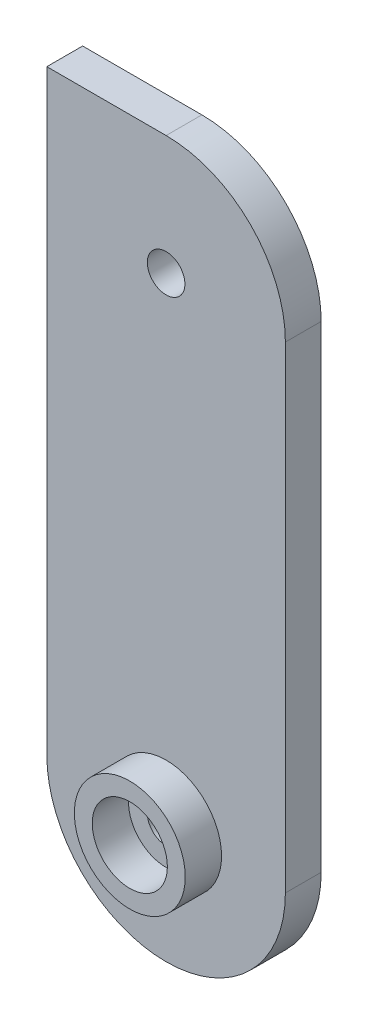
ISO-10303-21;
HEADER;
FILE_DESCRIPTION(('STEP AP214'),'2;1');
FILE_NAME('part.step','',(''),(''),'','','');
FILE_SCHEMA(('AUTOMOTIVE_DESIGN { 1 0 10303 214 1 1 1 1 }'));
ENDSEC;
DATA;
#1=APPLICATION_CONTEXT('core data for automotive mechanical design processes');
#2=APPLICATION_PROTOCOL_DEFINITION('international standard','automotive_design',2000,#1);
#3=PRODUCT_CONTEXT('',#1,'mechanical');
#4=PRODUCT('Part','Part','',(#3));
#5=PRODUCT_RELATED_PRODUCT_CATEGORY('part','',(#4));
#6=PRODUCT_DEFINITION_FORMATION('','',#4);
#7=PRODUCT_DEFINITION_CONTEXT('part definition',#1,'design');
#8=PRODUCT_DEFINITION('design','',#6,#7);
#9=PRODUCT_DEFINITION_SHAPE('','',#8);
#10=(LENGTH_UNIT() NAMED_UNIT(*) SI_UNIT(.MILLI.,.METRE.));
#11=(NAMED_UNIT(*) PLANE_ANGLE_UNIT() SI_UNIT($,.RADIAN.));
#12=(NAMED_UNIT(*) SI_UNIT($,.STERADIAN.) SOLID_ANGLE_UNIT());
#13=UNCERTAINTY_MEASURE_WITH_UNIT(LENGTH_MEASURE(1.E-05),#10,'distance_accuracy_value','');
#14=(GEOMETRIC_REPRESENTATION_CONTEXT(3) GLOBAL_UNCERTAINTY_ASSIGNED_CONTEXT((#13)) GLOBAL_UNIT_ASSIGNED_CONTEXT((#10,
#11,#12)) REPRESENTATION_CONTEXT('',''));
#15=CARTESIAN_POINT('',(0.,0.,0.));
#16=DIRECTION('',(0.,0.,1.));
#17=DIRECTION('',(1.,0.,0.));
#18=AXIS2_PLACEMENT_3D('',#15,#16,#17);
#19=CARTESIAN_POINT('',(-11.25,0.,3.));
#20=DIRECTION('',(1.,0.,0.));
#21=DIRECTION('',(0.,0.,-1.));
#22=AXIS2_PLACEMENT_3D('',#19,#20,#21);
#23=PLANE('',#22);
#24=DIRECTION('',(0.,-1.,0.));
#25=VECTOR('',#24,1.);
#26=CARTESIAN_POINT('',(-11.25,0.,0.));
#27=LINE('',#26,#25);
#28=CARTESIAN_POINT('',(-11.25,66.8088260387968,0.));
#29=VERTEX_POINT('',#28);
#30=CARTESIAN_POINT('',(-11.25,26.8088260387967,0.));
#31=VERTEX_POINT('',#30);
#32=EDGE_CURVE('E116',#29,#31,#27,.T.);
#33=ORIENTED_EDGE('',*,*,#32,.F.);
#34=DIRECTION('',(0.,0.,-1.));
#35=VECTOR('',#34,1.);
#36=CARTESIAN_POINT('',(-11.25,66.8088260387968,3.));
#37=LINE('',#36,#35);
#38=CARTESIAN_POINT('',(-11.25,66.8088260387968,3.));
#39=VERTEX_POINT('',#38);
#40=EDGE_CURVE('E48',#39,#29,#37,.T.);
#41=ORIENTED_EDGE('',*,*,#40,.F.);
#42=DIRECTION('',(0.,-1.,0.));
#43=VECTOR('',#42,1.);
#44=CARTESIAN_POINT('',(-11.25,0.,3.));
#45=LINE('',#44,#43);
#46=CARTESIAN_POINT('',(-11.25,26.8088260387967,3.));
#47=VERTEX_POINT('',#46);
#48=EDGE_CURVE('E127',#39,#47,#45,.T.);
#49=ORIENTED_EDGE('',*,*,#48,.T.);
#50=DIRECTION('',(0.,0.,-1.));
#51=VECTOR('',#50,1.);
#52=CARTESIAN_POINT('',(-11.25,26.8088260387967,3.));
#53=LINE('',#52,#51);
#54=EDGE_CURVE('E82',#47,#31,#53,.T.);
#55=ORIENTED_EDGE('',*,*,#54,.T.);
#56=EDGE_LOOP('',(#33,#41,#49,#55));
#57=FACE_BOUND('',#56,.T.);
#58=ADVANCED_FACE('F39',(#57),#23,.T.);
#59=CARTESIAN_POINT('',(-21.25,66.8088260387968,3.));
#60=DIRECTION('',(0.,0.,-1.));
#61=DIRECTION('',(-1.,0.,0.));
#62=AXIS2_PLACEMENT_3D('',#59,#60,#61);
#63=CYLINDRICAL_SURFACE('',#62,10.);
#64=CARTESIAN_POINT('',(-21.25,66.8088260387968,0.));
#65=DIRECTION('',(0.,0.,1.));
#66=DIRECTION('',(1.,0.,0.));
#67=AXIS2_PLACEMENT_3D('',#64,#65,#66);
#68=CIRCLE('',#67,10.);
#69=CARTESIAN_POINT('',(-21.25,76.8088260387967,0.));
#70=VERTEX_POINT('',#69);
#71=EDGE_CURVE('E119',#29,#70,#68,.T.);
#72=ORIENTED_EDGE('',*,*,#71,.T.);
#73=DIRECTION('',(0.,0.,-1.));
#74=VECTOR('',#73,1.);
#75=CARTESIAN_POINT('',(-21.25,76.8088260387967,3.));
#76=LINE('',#75,#74);
#77=CARTESIAN_POINT('',(-21.25,76.8088260387967,3.));
#78=VERTEX_POINT('',#77);
#79=EDGE_CURVE('E109',#78,#70,#76,.T.);
#80=ORIENTED_EDGE('',*,*,#79,.F.);
#81=CARTESIAN_POINT('',(-21.25,66.8088260387968,3.));
#82=DIRECTION('',(0.,0.,1.));
#83=DIRECTION('',(1.,0.,0.));
#84=AXIS2_PLACEMENT_3D('',#81,#82,#83);
#85=CIRCLE('',#84,10.);
#86=EDGE_CURVE('E96',#39,#78,#85,.T.);
#87=ORIENTED_EDGE('',*,*,#86,.F.);
#88=ORIENTED_EDGE('',*,*,#40,.T.);
#89=EDGE_LOOP('',(#72,#80,#87,#88));
#90=FACE_BOUND('',#89,.T.);
#91=ADVANCED_FACE('F133',(#90),#63,.T.);
#92=CARTESIAN_POINT('',(0.,76.8088260387967,3.));
#93=DIRECTION('',(0.,-1.,0.));
#94=DIRECTION('',(0.,0.,-1.));
#95=AXIS2_PLACEMENT_3D('',#92,#93,#94);
#96=PLANE('',#95);
#97=DIRECTION('',(-1.,0.,0.));
#98=VECTOR('',#97,1.);
#99=CARTESIAN_POINT('',(0.,76.8088260387967,0.));
#100=LINE('',#99,#98);
#101=CARTESIAN_POINT('',(-31.25,76.8088260387967,0.));
#102=VERTEX_POINT('',#101);
#103=EDGE_CURVE('E105',#70,#102,#100,.T.);
#104=ORIENTED_EDGE('',*,*,#103,.T.);
#105=DIRECTION('',(0.,0.,-1.));
#106=VECTOR('',#105,1.);
#107=CARTESIAN_POINT('',(-31.25,76.8088260387967,3.));
#108=LINE('',#107,#106);
#109=CARTESIAN_POINT('',(-31.25,76.8088260387967,3.));
#110=VERTEX_POINT('',#109);
#111=EDGE_CURVE('E102',#110,#102,#108,.T.);
#112=ORIENTED_EDGE('',*,*,#111,.F.);
#113=DIRECTION('',(-1.,0.,0.));
#114=VECTOR('',#113,1.);
#115=CARTESIAN_POINT('',(0.,76.8088260387967,3.));
#116=LINE('',#115,#114);
#117=EDGE_CURVE('E91',#78,#110,#116,.T.);
#118=ORIENTED_EDGE('',*,*,#117,.F.);
#119=ORIENTED_EDGE('',*,*,#79,.T.);
#120=EDGE_LOOP('',(#104,#112,#118,#119));
#121=FACE_BOUND('',#120,.T.);
#122=ADVANCED_FACE('F103',(#121),#96,.F.);
#123=CARTESIAN_POINT('',(-31.25,0.,3.));
#124=DIRECTION('',(-1.,0.,0.));
#125=DIRECTION('',(0.,0.,1.));
#126=AXIS2_PLACEMENT_3D('',#123,#124,#125);
#127=PLANE('',#126);
#128=DIRECTION('',(0.,1.,0.));
#129=VECTOR('',#128,1.);
#130=CARTESIAN_POINT('',(-31.25,0.,0.));
#131=LINE('',#130,#129);
#132=CARTESIAN_POINT('',(-31.25,26.8088260387967,0.));
#133=VERTEX_POINT('',#132);
#134=EDGE_CURVE('E123',#133,#102,#131,.T.);
#135=ORIENTED_EDGE('',*,*,#134,.F.);
#136=DIRECTION('',(0.,0.,-1.));
#137=VECTOR('',#136,1.);
#138=CARTESIAN_POINT('',(-31.25,26.8088260387967,3.));
#139=LINE('',#138,#137);
#140=CARTESIAN_POINT('',(-31.25,26.8088260387967,3.));
#141=VERTEX_POINT('',#140);
#142=EDGE_CURVE('E75',#141,#133,#139,.T.);
#143=ORIENTED_EDGE('',*,*,#142,.F.);
#144=DIRECTION('',(0.,1.,0.));
#145=VECTOR('',#144,1.);
#146=CARTESIAN_POINT('',(-31.25,0.,3.));
#147=LINE('',#146,#145);
#148=EDGE_CURVE('E95',#141,#110,#147,.T.);
#149=ORIENTED_EDGE('',*,*,#148,.T.);
#150=ORIENTED_EDGE('',*,*,#111,.T.);
#151=EDGE_LOOP('',(#135,#143,#149,#150));
#152=FACE_BOUND('',#151,.T.);
#153=ADVANCED_FACE('F111',(#152),#127,.T.);
#154=CARTESIAN_POINT('',(-21.25,26.8088260387967,3.));
#155=DIRECTION('',(0.,0.,-1.));
#156=DIRECTION('',(-1.,0.,0.));
#157=AXIS2_PLACEMENT_3D('',#154,#155,#156);
#158=CYLINDRICAL_SURFACE('',#157,10.);
#159=CARTESIAN_POINT('',(-21.25,26.8088260387967,0.));
#160=DIRECTION('',(0.,0.,1.));
#161=DIRECTION('',(1.,0.,0.));
#162=AXIS2_PLACEMENT_3D('',#159,#160,#161);
#163=CIRCLE('',#162,10.);
#164=EDGE_CURVE('E125',#133,#31,#163,.T.);
#165=ORIENTED_EDGE('',*,*,#164,.T.);
#166=ORIENTED_EDGE('',*,*,#54,.F.);
#167=CARTESIAN_POINT('',(-21.25,26.8088260387967,3.));
#168=DIRECTION('',(0.,0.,1.));
#169=DIRECTION('',(1.,0.,0.));
#170=AXIS2_PLACEMENT_3D('',#167,#168,#169);
#171=CIRCLE('',#170,10.);
#172=EDGE_CURVE('E56',#141,#47,#171,.T.);
#173=ORIENTED_EDGE('',*,*,#172,.F.);
#174=ORIENTED_EDGE('',*,*,#142,.T.);
#175=EDGE_LOOP('',(#165,#166,#173,#174));
#176=FACE_BOUND('',#175,.T.);
#177=ADVANCED_FACE('F147',(#176),#158,.T.);
#178=CARTESIAN_POINT('',(0.,0.,3.));
#179=DIRECTION('',(0.,0.,1.));
#180=DIRECTION('',(1.,0.,0.));
#181=AXIS2_PLACEMENT_3D('',#178,#179,#180);
#182=PLANE('',#181);
#183=CARTESIAN_POINT('',(-21.25,66.8088260387968,3.));
#184=DIRECTION('',(0.,0.,1.));
#185=DIRECTION('',(1.,0.,0.));
#186=AXIS2_PLACEMENT_3D('',#183,#184,#185);
#187=CIRCLE('',#186,1.57499999999999);
#188=CARTESIAN_POINT('',(-19.675,66.8088260387968,3.));
#189=VERTEX_POINT('',#188);
#190=EDGE_CURVE('E181',#189,#189,#187,.T.);
#191=ORIENTED_EDGE('',*,*,#190,.F.);
#192=EDGE_LOOP('',(#191));
#193=FACE_BOUND('',#192,.T.);
#194=CARTESIAN_POINT('',(-21.25,26.8088260387967,3.));
#195=DIRECTION('',(0.,0.,1.));
#196=DIRECTION('',(1.,0.,0.));
#197=AXIS2_PLACEMENT_3D('',#194,#195,#196);
#198=CIRCLE('',#197,4.65);
#199=CARTESIAN_POINT('',(-16.6,26.8088260387967,3.));
#200=VERTEX_POINT('',#199);
#201=EDGE_CURVE('E191',#200,#200,#198,.T.);
#202=ORIENTED_EDGE('',*,*,#201,.F.);
#203=EDGE_LOOP('',(#202));
#204=FACE_BOUND('',#203,.T.);
#205=ORIENTED_EDGE('',*,*,#48,.F.);
#206=ORIENTED_EDGE('',*,*,#86,.T.);
#207=ORIENTED_EDGE('',*,*,#117,.T.);
#208=ORIENTED_EDGE('',*,*,#148,.F.);
#209=ORIENTED_EDGE('',*,*,#172,.T.);
#210=EDGE_LOOP('',(#205,#206,#207,#208,#209));
#211=FACE_BOUND('',#210,.T.);
#212=ADVANCED_FACE('F93',(#193,#204,#211),#182,.T.);
#213=CARTESIAN_POINT('',(0.,0.,0.));
#214=DIRECTION('',(0.,0.,1.));
#215=DIRECTION('',(1.,0.,0.));
#216=AXIS2_PLACEMENT_3D('',#213,#214,#215);
#217=PLANE('',#216);
#218=CARTESIAN_POINT('',(-21.25,66.8088260387968,0.));
#219=DIRECTION('',(0.,0.,-1.));
#220=DIRECTION('',(-1.,0.,0.));
#221=AXIS2_PLACEMENT_3D('',#218,#219,#220);
#222=CIRCLE('',#221,1.57499999999999);
#223=CARTESIAN_POINT('',(-22.825,66.8088260387968,0.));
#224=VERTEX_POINT('',#223);
#225=EDGE_CURVE('E184',#224,#224,#222,.T.);
#226=ORIENTED_EDGE('',*,*,#225,.F.);
#227=EDGE_LOOP('',(#226));
#228=FACE_BOUND('',#227,.T.);
#229=CARTESIAN_POINT('',(-21.25,26.8088260387968,0.));
#230=DIRECTION('',(0.,0.,-1.));
#231=DIRECTION('',(-1.,0.,0.));
#232=AXIS2_PLACEMENT_3D('',#229,#230,#231);
#233=CIRCLE('',#232,1.575);
#234=CARTESIAN_POINT('',(-22.825,26.8088260387968,0.));
#235=VERTEX_POINT('',#234);
#236=EDGE_CURVE('E186',#235,#235,#233,.T.);
#237=ORIENTED_EDGE('',*,*,#236,.F.);
#238=EDGE_LOOP('',(#237));
#239=FACE_BOUND('',#238,.T.);
#240=ORIENTED_EDGE('',*,*,#32,.T.);
#241=ORIENTED_EDGE('',*,*,#164,.F.);
#242=ORIENTED_EDGE('',*,*,#134,.T.);
#243=ORIENTED_EDGE('',*,*,#103,.F.);
#244=ORIENTED_EDGE('',*,*,#71,.F.);
#245=EDGE_LOOP('',(#240,#241,#242,#243,#244));
#246=FACE_BOUND('',#245,.T.);
#247=ADVANCED_FACE('F135',(#228,#239,#246),#217,.F.);
#248=CARTESIAN_POINT('',(-21.25,26.8088260387967,19.1965802190821));
#249=DIRECTION('',(0.,0.,-1.));
#250=DIRECTION('',(-1.,0.,0.));
#251=AXIS2_PLACEMENT_3D('',#248,#249,#250);
#252=CYLINDRICAL_SURFACE('',#251,3.15);
#253=CARTESIAN_POINT('',(-21.25,26.8088260387967,3.));
#254=DIRECTION('',(0.,0.,1.));
#255=DIRECTION('',(1.,0.,0.));
#256=AXIS2_PLACEMENT_3D('',#253,#254,#255);
#257=CIRCLE('',#256,3.15);
#258=CARTESIAN_POINT('',(-18.1,26.8088260387967,3.));
#259=VERTEX_POINT('',#258);
#260=EDGE_CURVE('E11',#259,#259,#257,.F.);
#261=ORIENTED_EDGE('',*,*,#260,.T.);
#262=EDGE_LOOP('',(#261));
#263=FACE_BOUND('',#262,.T.);
#264=CARTESIAN_POINT('',(-21.25,26.8088260387967,6.04439408901233));
#265=DIRECTION('',(0.,0.,1.));
#266=DIRECTION('',(1.,0.,0.));
#267=AXIS2_PLACEMENT_3D('',#264,#265,#266);
#268=CIRCLE('',#267,3.15);
#269=CARTESIAN_POINT('',(-18.1,26.8088260387967,6.04439408901233));
#270=VERTEX_POINT('',#269);
#271=EDGE_CURVE('E194',#270,#270,#268,.T.);
#272=ORIENTED_EDGE('',*,*,#271,.T.);
#273=EDGE_LOOP('',(#272));
#274=FACE_BOUND('',#273,.T.);
#275=ADVANCED_FACE('F152',(#263,#274),#252,.F.);
#276=CARTESIAN_POINT('',(-21.25,26.8088260387967,19.1965802190821));
#277=DIRECTION('',(0.,0.,-1.));
#278=DIRECTION('',(-1.,0.,0.));
#279=AXIS2_PLACEMENT_3D('',#276,#277,#278);
#280=CYLINDRICAL_SURFACE('',#279,4.65);
#281=ORIENTED_EDGE('',*,*,#201,.T.);
#282=EDGE_LOOP('',(#281));
#283=FACE_BOUND('',#282,.T.);
#284=CARTESIAN_POINT('',(-21.25,26.8088260387967,6.04439408901233));
#285=DIRECTION('',(0.,0.,1.));
#286=DIRECTION('',(1.,0.,0.));
#287=AXIS2_PLACEMENT_3D('',#284,#285,#286);
#288=CIRCLE('',#287,4.65);
#289=CARTESIAN_POINT('',(-16.6,26.8088260387967,6.04439408901233));
#290=VERTEX_POINT('',#289);
#291=EDGE_CURVE('E120',#290,#290,#288,.T.);
#292=ORIENTED_EDGE('',*,*,#291,.F.);
#293=EDGE_LOOP('',(#292));
#294=FACE_BOUND('',#293,.T.);
#295=ADVANCED_FACE('F161',(#283,#294),#280,.T.);
#296=CARTESIAN_POINT('',(-33.7267079346029,-0.391173961203255,6.04439408901233));
#297=DIRECTION('',(0.,0.,1.));
#298=DIRECTION('',(0.,-1.,0.));
#299=AXIS2_PLACEMENT_3D('',#296,#297,#298);
#300=PLANE('',#299);
#301=ORIENTED_EDGE('',*,*,#271,.F.);
#302=EDGE_LOOP('',(#301));
#303=FACE_BOUND('',#302,.T.);
#304=ORIENTED_EDGE('',*,*,#291,.T.);
#305=EDGE_LOOP('',(#304));
#306=FACE_BOUND('',#305,.T.);
#307=ADVANCED_FACE('F158',(#303,#306),#300,.T.);
#308=CARTESIAN_POINT('',(-21.25,26.8088260387968,3.));
#309=DIRECTION('',(0.,0.,1.));
#310=DIRECTION('',(1.,0.,0.));
#311=AXIS2_PLACEMENT_3D('',#308,#309,#310);
#312=CIRCLE('',#311,1.575);
#313=CARTESIAN_POINT('',(-19.675,26.8088260387968,3.));
#314=VERTEX_POINT('',#313);
#315=EDGE_CURVE('E42',#314,#314,#312,.T.);
#316=ORIENTED_EDGE('',*,*,#315,.F.);
#317=EDGE_LOOP('',(#316));
#318=FACE_BOUND('',#317,.T.);
#319=ORIENTED_EDGE('',*,*,#260,.F.);
#320=EDGE_LOOP('',(#319));
#321=FACE_BOUND('',#320,.T.);
#322=ADVANCED_FACE('F157',(#318,#321),#182,.T.);
#323=CARTESIAN_POINT('',(-21.25,26.8088260387968,10.4991668104876));
#324=DIRECTION('',(0.,0.,-1.));
#325=DIRECTION('',(-1.,0.,0.));
#326=AXIS2_PLACEMENT_3D('',#323,#324,#325);
#327=CYLINDRICAL_SURFACE('',#326,1.575);
#328=ORIENTED_EDGE('',*,*,#315,.T.);
#329=EDGE_LOOP('',(#328));
#330=FACE_BOUND('',#329,.T.);
#331=ORIENTED_EDGE('',*,*,#236,.T.);
#332=EDGE_LOOP('',(#331));
#333=FACE_BOUND('',#332,.T.);
#334=ADVANCED_FACE('F169',(#330,#333),#327,.F.);
#335=CARTESIAN_POINT('',(-21.25,66.8088260387968,12.));
#336=DIRECTION('',(0.,0.,-1.));
#337=DIRECTION('',(-1.,0.,0.));
#338=AXIS2_PLACEMENT_3D('',#335,#336,#337);
#339=CYLINDRICAL_SURFACE('',#338,1.57499999999999);
#340=ORIENTED_EDGE('',*,*,#190,.T.);
#341=EDGE_LOOP('',(#340));
#342=FACE_BOUND('',#341,.T.);
#343=ORIENTED_EDGE('',*,*,#225,.T.);
#344=EDGE_LOOP('',(#343));
#345=FACE_BOUND('',#344,.T.);
#346=ADVANCED_FACE('F172',(#342,#345),#339,.F.);
#347=CLOSED_SHELL('',(#58,#91,#122,#153,#177,#212,#247,#275,#295,#307,#322,#334,#346));
#348=MANIFOLD_SOLID_BREP('B2',#347);
#349=ADVANCED_BREP_SHAPE_REPRESENTATION('',(#18,#348),#14);
#350=SHAPE_DEFINITION_REPRESENTATION(#9,#349);
ENDSEC;
END-ISO-10303-21;
